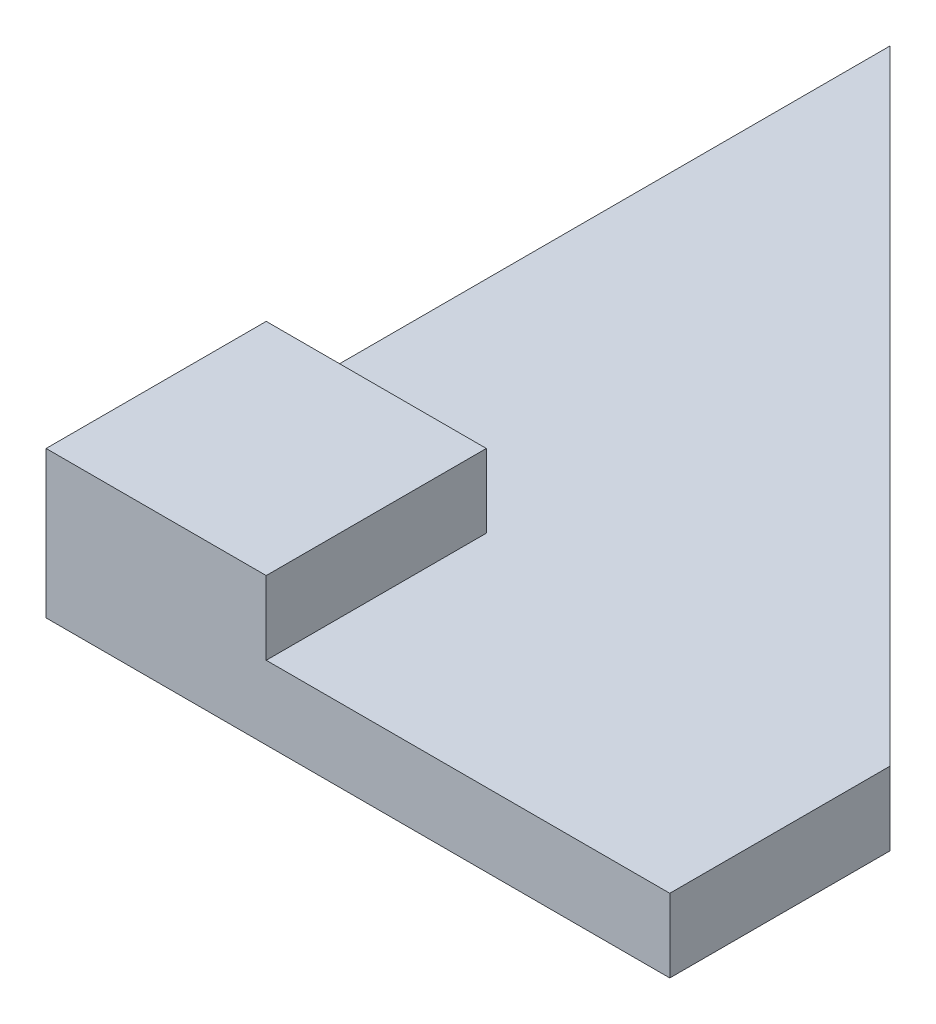
ISO-10303-21;
HEADER;
FILE_DESCRIPTION(('STEP AP214'),'2;1');
FILE_NAME('part.step','',(''),(''),'','','');
FILE_SCHEMA(('AUTOMOTIVE_DESIGN { 1 0 10303 214 1 1 1 1 }'));
ENDSEC;
DATA;
#1=APPLICATION_CONTEXT('core data for automotive mechanical design processes');
#2=APPLICATION_PROTOCOL_DEFINITION('international standard','automotive_design',2000,#1);
#3=PRODUCT_CONTEXT('',#1,'mechanical');
#4=PRODUCT('Part','Part','',(#3));
#5=PRODUCT_RELATED_PRODUCT_CATEGORY('part','',(#4));
#6=PRODUCT_DEFINITION_FORMATION('','',#4);
#7=PRODUCT_DEFINITION_CONTEXT('part definition',#1,'design');
#8=PRODUCT_DEFINITION('design','',#6,#7);
#9=PRODUCT_DEFINITION_SHAPE('','',#8);
#10=(LENGTH_UNIT() NAMED_UNIT(*) SI_UNIT(.MILLI.,.METRE.));
#11=(NAMED_UNIT(*) PLANE_ANGLE_UNIT() SI_UNIT($,.RADIAN.));
#12=(NAMED_UNIT(*) SI_UNIT($,.STERADIAN.) SOLID_ANGLE_UNIT());
#13=UNCERTAINTY_MEASURE_WITH_UNIT(LENGTH_MEASURE(1.E-05),#10,'distance_accuracy_value','');
#14=(GEOMETRIC_REPRESENTATION_CONTEXT(3) GLOBAL_UNCERTAINTY_ASSIGNED_CONTEXT((#13)) GLOBAL_UNIT_ASSIGNED_CONTEXT((#10,
#11,#12)) REPRESENTATION_CONTEXT('',''));
#15=CARTESIAN_POINT('',(0.,0.,0.));
#16=DIRECTION('',(0.,0.,1.));
#17=DIRECTION('',(1.,0.,0.));
#18=AXIS2_PLACEMENT_3D('',#15,#16,#17);
#19=CARTESIAN_POINT('',(15.,10.,15.));
#20=DIRECTION('',(-1.,0.,0.));
#21=DIRECTION('',(0.,0.,1.));
#22=AXIS2_PLACEMENT_3D('',#19,#20,#21);
#23=PLANE('',#22);
#24=DIRECTION('',(0.,0.,-1.));
#25=VECTOR('',#24,1.);
#26=CARTESIAN_POINT('',(15.,0.,15.));
#27=LINE('',#26,#25);
#28=CARTESIAN_POINT('',(15.,0.,15.));
#29=VERTEX_POINT('',#28);
#30=CARTESIAN_POINT('',(15.,0.,-15.));
#31=VERTEX_POINT('',#30);
#32=EDGE_CURVE('E153',#29,#31,#27,.T.);
#33=ORIENTED_EDGE('',*,*,#32,.T.);
#34=DIRECTION('',(0.,-1.,0.));
#35=VECTOR('',#34,1.);
#36=CARTESIAN_POINT('',(15.,10.,-15.));
#37=LINE('',#36,#35);
#38=CARTESIAN_POINT('',(15.,10.,-15.));
#39=VERTEX_POINT('',#38);
#40=EDGE_CURVE('E11',#39,#31,#37,.T.);
#41=ORIENTED_EDGE('',*,*,#40,.F.);
#42=DIRECTION('',(0.,0.,-1.));
#43=VECTOR('',#42,1.);
#44=CARTESIAN_POINT('',(15.,10.,15.));
#45=LINE('',#44,#43);
#46=CARTESIAN_POINT('',(15.,10.,15.));
#47=VERTEX_POINT('',#46);
#48=EDGE_CURVE('E154',#47,#39,#45,.T.);
#49=ORIENTED_EDGE('',*,*,#48,.F.);
#50=DIRECTION('',(0.,-1.,0.));
#51=VECTOR('',#50,1.);
#52=CARTESIAN_POINT('',(15.,10.,15.));
#53=LINE('',#52,#51);
#54=EDGE_CURVE('E107',#47,#29,#53,.T.);
#55=ORIENTED_EDGE('',*,*,#54,.T.);
#56=EDGE_LOOP('',(#33,#41,#49,#55));
#57=FACE_BOUND('',#56,.T.);
#58=ADVANCED_FACE('F43',(#57),#23,.F.);
#59=CARTESIAN_POINT('',(-15.,10.,-15.));
#60=DIRECTION('',(0.,0.,1.));
#61=DIRECTION('',(1.,0.,0.));
#62=AXIS2_PLACEMENT_3D('',#59,#60,#61);
#63=PLANE('',#62);
#64=DIRECTION('',(-1.,0.,0.));
#65=VECTOR('',#64,1.);
#66=CARTESIAN_POINT('',(-15.,0.,-15.));
#67=LINE('',#66,#65);
#68=CARTESIAN_POINT('',(-15.,0.,-15.));
#69=VERTEX_POINT('',#68);
#70=EDGE_CURVE('E158',#31,#69,#67,.T.);
#71=ORIENTED_EDGE('',*,*,#70,.T.);
#72=DIRECTION('',(0.,-1.,0.));
#73=VECTOR('',#72,1.);
#74=CARTESIAN_POINT('',(-15.,10.,-15.));
#75=LINE('',#74,#73);
#76=CARTESIAN_POINT('',(-15.,10.,-15.));
#77=VERTEX_POINT('',#76);
#78=EDGE_CURVE('E52',#77,#69,#75,.T.);
#79=ORIENTED_EDGE('',*,*,#78,.F.);
#80=DIRECTION('',(-1.,0.,0.));
#81=VECTOR('',#80,1.);
#82=CARTESIAN_POINT('',(-15.,10.,-15.));
#83=LINE('',#82,#81);
#84=EDGE_CURVE('E157',#39,#77,#83,.T.);
#85=ORIENTED_EDGE('',*,*,#84,.F.);
#86=ORIENTED_EDGE('',*,*,#40,.T.);
#87=EDGE_LOOP('',(#71,#79,#85,#86));
#88=FACE_BOUND('',#87,.T.);
#89=ADVANCED_FACE('F178',(#88),#63,.F.);
#90=CARTESIAN_POINT('',(-15.,10.,15.));
#91=DIRECTION('',(1.,0.,0.));
#92=DIRECTION('',(0.,0.,-1.));
#93=AXIS2_PLACEMENT_3D('',#90,#91,#92);
#94=PLANE('',#93);
#95=ORIENTED_EDGE('',*,*,#78,.T.);
#96=DIRECTION('',(0.,0.,-1.));
#97=VECTOR('',#96,1.);
#98=CARTESIAN_POINT('',(-15.,0.,0.));
#99=LINE('',#98,#97);
#100=CARTESIAN_POINT('',(-15.,0.,-100.));
#101=VERTEX_POINT('',#100);
#102=EDGE_CURVE('E140',#69,#101,#99,.T.);
#103=ORIENTED_EDGE('',*,*,#102,.T.);
#104=DIRECTION('',(0.,1.,0.));
#105=VECTOR('',#104,1.);
#106=CARTESIAN_POINT('',(-15.,-10.,-100.));
#107=LINE('',#106,#105);
#108=CARTESIAN_POINT('',(-15.,-10.,-100.));
#109=VERTEX_POINT('',#108);
#110=EDGE_CURVE('E114',#109,#101,#107,.T.);
#111=ORIENTED_EDGE('',*,*,#110,.F.);
#112=DIRECTION('',(0.,0.,-1.));
#113=VECTOR('',#112,1.);
#114=CARTESIAN_POINT('',(-15.,-10.,0.));
#115=LINE('',#114,#113);
#116=CARTESIAN_POINT('',(-15.,-10.,15.));
#117=VERTEX_POINT('',#116);
#118=EDGE_CURVE('E110',#117,#109,#115,.T.);
#119=ORIENTED_EDGE('',*,*,#118,.F.);
#120=DIRECTION('',(0.,-1.,0.));
#121=VECTOR('',#120,1.);
#122=CARTESIAN_POINT('',(-15.,10.,15.));
#123=LINE('',#122,#121);
#124=CARTESIAN_POINT('',(-15.,10.,15.));
#125=VERTEX_POINT('',#124);
#126=EDGE_CURVE('E98',#125,#117,#123,.T.);
#127=ORIENTED_EDGE('',*,*,#126,.F.);
#128=DIRECTION('',(0.,0.,1.));
#129=VECTOR('',#128,1.);
#130=CARTESIAN_POINT('',(-15.,10.,15.));
#131=LINE('',#130,#129);
#132=EDGE_CURVE('E161',#77,#125,#131,.T.);
#133=ORIENTED_EDGE('',*,*,#132,.F.);
#134=EDGE_LOOP('',(#95,#103,#111,#119,#127,#133));
#135=FACE_BOUND('',#134,.T.);
#136=ADVANCED_FACE('F112',(#135),#94,.F.);
#137=CARTESIAN_POINT('',(-15.,10.,15.));
#138=DIRECTION('',(0.,0.,-1.));
#139=DIRECTION('',(-1.,0.,0.));
#140=AXIS2_PLACEMENT_3D('',#137,#138,#139);
#141=PLANE('',#140);
#142=ORIENTED_EDGE('',*,*,#126,.T.);
#143=DIRECTION('',(-1.,0.,0.));
#144=VECTOR('',#143,1.);
#145=CARTESIAN_POINT('',(0.,-10.,15.));
#146=LINE('',#145,#144);
#147=CARTESIAN_POINT('',(70.,-10.,15.));
#148=VERTEX_POINT('',#147);
#149=EDGE_CURVE('E103',#148,#117,#146,.T.);
#150=ORIENTED_EDGE('',*,*,#149,.F.);
#151=DIRECTION('',(0.,1.,0.));
#152=VECTOR('',#151,1.);
#153=CARTESIAN_POINT('',(70.,-10.,15.));
#154=LINE('',#153,#152);
#155=CARTESIAN_POINT('',(70.,0.,15.));
#156=VERTEX_POINT('',#155);
#157=EDGE_CURVE('E135',#148,#156,#154,.T.);
#158=ORIENTED_EDGE('',*,*,#157,.T.);
#159=DIRECTION('',(-1.,0.,0.));
#160=VECTOR('',#159,1.);
#161=CARTESIAN_POINT('',(0.,0.,15.));
#162=LINE('',#161,#160);
#163=EDGE_CURVE('E136',#156,#29,#162,.T.);
#164=ORIENTED_EDGE('',*,*,#163,.T.);
#165=ORIENTED_EDGE('',*,*,#54,.F.);
#166=DIRECTION('',(1.,0.,0.));
#167=VECTOR('',#166,1.);
#168=CARTESIAN_POINT('',(-15.,10.,15.));
#169=LINE('',#168,#167);
#170=EDGE_CURVE('E59',#125,#47,#169,.T.);
#171=ORIENTED_EDGE('',*,*,#170,.F.);
#172=EDGE_LOOP('',(#142,#150,#158,#164,#165,#171));
#173=FACE_BOUND('',#172,.T.);
#174=ADVANCED_FACE('F100',(#173),#141,.F.);
#175=CARTESIAN_POINT('',(0.,10.,0.));
#176=DIRECTION('',(0.,-1.,0.));
#177=DIRECTION('',(0.,0.,-1.));
#178=AXIS2_PLACEMENT_3D('',#175,#176,#177);
#179=PLANE('',#178);
#180=ORIENTED_EDGE('',*,*,#48,.T.);
#181=ORIENTED_EDGE('',*,*,#84,.T.);
#182=ORIENTED_EDGE('',*,*,#132,.T.);
#183=ORIENTED_EDGE('',*,*,#170,.T.);
#184=EDGE_LOOP('',(#180,#181,#182,#183));
#185=FACE_BOUND('',#184,.T.);
#186=ADVANCED_FACE('F192',(#185),#179,.F.);
#187=CARTESIAN_POINT('',(42.5,-10.,-42.5));
#188=DIRECTION('',(-0.707106781186548,0.,0.707106781186548));
#189=DIRECTION('',(0.707106781186548,0.,0.707106781186548));
#190=AXIS2_PLACEMENT_3D('',#187,#188,#189);
#191=PLANE('',#190);
#192=DIRECTION('',(0.707106781186548,0.,0.707106781186548));
#193=VECTOR('',#192,1.);
#194=CARTESIAN_POINT('',(42.5,0.,-42.5));
#195=LINE('',#194,#193);
#196=CARTESIAN_POINT('',(70.,0.,-15.));
#197=VERTEX_POINT('',#196);
#198=EDGE_CURVE('E128',#101,#197,#195,.T.);
#199=ORIENTED_EDGE('',*,*,#198,.T.);
#200=DIRECTION('',(0.,1.,0.));
#201=VECTOR('',#200,1.);
#202=CARTESIAN_POINT('',(70.,-10.,-15.));
#203=LINE('',#202,#201);
#204=CARTESIAN_POINT('',(70.,-10.,-15.));
#205=VERTEX_POINT('',#204);
#206=EDGE_CURVE('E147',#205,#197,#203,.T.);
#207=ORIENTED_EDGE('',*,*,#206,.F.);
#208=DIRECTION('',(0.707106781186548,0.,0.707106781186548));
#209=VECTOR('',#208,1.);
#210=CARTESIAN_POINT('',(42.5,-10.,-42.5));
#211=LINE('',#210,#209);
#212=EDGE_CURVE('E118',#109,#205,#211,.T.);
#213=ORIENTED_EDGE('',*,*,#212,.F.);
#214=ORIENTED_EDGE('',*,*,#110,.T.);
#215=EDGE_LOOP('',(#199,#207,#213,#214));
#216=FACE_BOUND('',#215,.T.);
#217=ADVANCED_FACE('F187',(#216),#191,.F.);
#218=CARTESIAN_POINT('',(70.,-10.,0.));
#219=DIRECTION('',(-1.,0.,0.));
#220=DIRECTION('',(0.,0.,1.));
#221=AXIS2_PLACEMENT_3D('',#218,#219,#220);
#222=PLANE('',#221);
#223=DIRECTION('',(0.,0.,1.));
#224=VECTOR('',#223,1.);
#225=CARTESIAN_POINT('',(70.,0.,0.));
#226=LINE('',#225,#224);
#227=EDGE_CURVE('E125',#197,#156,#226,.T.);
#228=ORIENTED_EDGE('',*,*,#227,.T.);
#229=ORIENTED_EDGE('',*,*,#157,.F.);
#230=DIRECTION('',(0.,0.,1.));
#231=VECTOR('',#230,1.);
#232=CARTESIAN_POINT('',(70.,-10.,0.));
#233=LINE('',#232,#231);
#234=EDGE_CURVE('E122',#205,#148,#233,.T.);
#235=ORIENTED_EDGE('',*,*,#234,.F.);
#236=ORIENTED_EDGE('',*,*,#206,.T.);
#237=EDGE_LOOP('',(#228,#229,#235,#236));
#238=FACE_BOUND('',#237,.T.);
#239=ADVANCED_FACE('F189',(#238),#222,.F.);
#240=CARTESIAN_POINT('',(0.,-10.,0.));
#241=DIRECTION('',(0.,-1.,0.));
#242=DIRECTION('',(0.,0.,-1.));
#243=AXIS2_PLACEMENT_3D('',#240,#241,#242);
#244=PLANE('',#243);
#245=ORIENTED_EDGE('',*,*,#149,.T.);
#246=ORIENTED_EDGE('',*,*,#118,.T.);
#247=ORIENTED_EDGE('',*,*,#212,.T.);
#248=ORIENTED_EDGE('',*,*,#234,.T.);
#249=EDGE_LOOP('',(#245,#246,#247,#248));
#250=FACE_BOUND('',#249,.T.);
#251=ADVANCED_FACE('F120',(#250),#244,.T.);
#252=CARTESIAN_POINT('',(0.,0.,0.));
#253=DIRECTION('',(0.,-1.,0.));
#254=DIRECTION('',(0.,0.,-1.));
#255=AXIS2_PLACEMENT_3D('',#252,#253,#254);
#256=PLANE('',#255);
#257=ORIENTED_EDGE('',*,*,#32,.F.);
#258=ORIENTED_EDGE('',*,*,#163,.F.);
#259=ORIENTED_EDGE('',*,*,#227,.F.);
#260=ORIENTED_EDGE('',*,*,#198,.F.);
#261=ORIENTED_EDGE('',*,*,#102,.F.);
#262=ORIENTED_EDGE('',*,*,#70,.F.);
#263=EDGE_LOOP('',(#257,#258,#259,#260,#261,#262));
#264=FACE_BOUND('',#263,.T.);
#265=ADVANCED_FACE('F181',(#264),#256,.F.);
#266=CLOSED_SHELL('',(#58,#89,#136,#174,#186,#217,#239,#251,#265));
#267=MANIFOLD_SOLID_BREP('B2',#266);
#268=ADVANCED_BREP_SHAPE_REPRESENTATION('',(#18,#267),#14);
#269=SHAPE_DEFINITION_REPRESENTATION(#9,#268);
ENDSEC;
END-ISO-10303-21;
